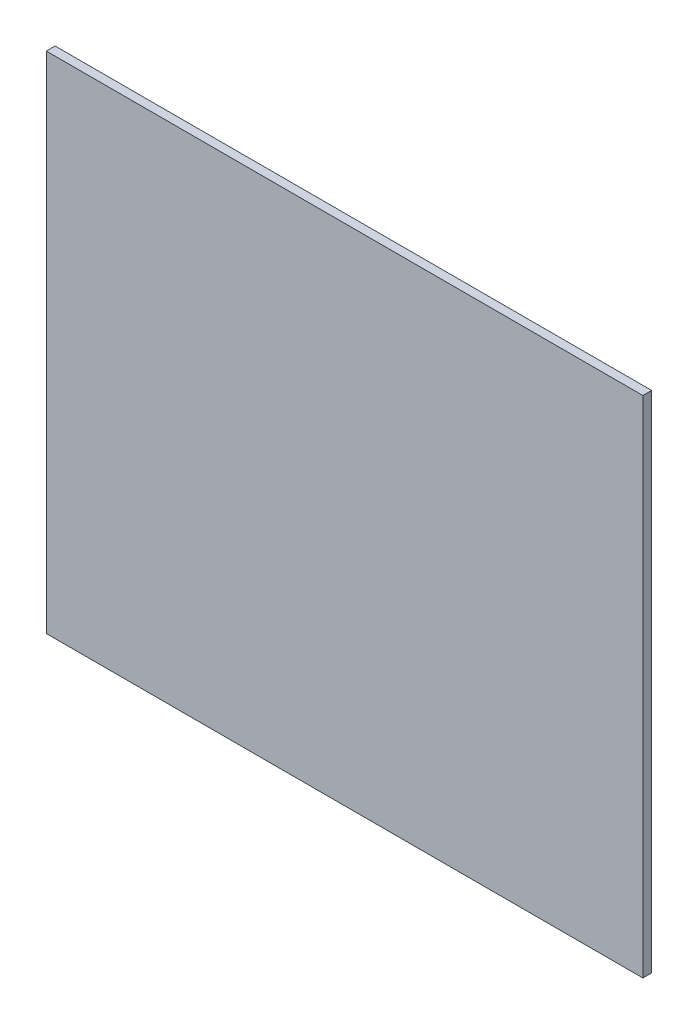
ISO-10303-21;
HEADER;
FILE_DESCRIPTION(('STEP AP214'),'2;1');
FILE_NAME('part.step','',(''),(''),'','','');
FILE_SCHEMA(('AUTOMOTIVE_DESIGN { 1 0 10303 214 1 1 1 1 }'));
ENDSEC;
DATA;
#1=APPLICATION_CONTEXT('core data for automotive mechanical design processes');
#2=APPLICATION_PROTOCOL_DEFINITION('international standard','automotive_design',2000,#1);
#3=PRODUCT_CONTEXT('',#1,'mechanical');
#4=PRODUCT('Part','Part','',(#3));
#5=PRODUCT_RELATED_PRODUCT_CATEGORY('part','',(#4));
#6=PRODUCT_DEFINITION_FORMATION('','',#4);
#7=PRODUCT_DEFINITION_CONTEXT('part definition',#1,'design');
#8=PRODUCT_DEFINITION('design','',#6,#7);
#9=PRODUCT_DEFINITION_SHAPE('','',#8);
#10=(LENGTH_UNIT() NAMED_UNIT(*) SI_UNIT(.MILLI.,.METRE.));
#11=(NAMED_UNIT(*) PLANE_ANGLE_UNIT() SI_UNIT($,.RADIAN.));
#12=(NAMED_UNIT(*) SI_UNIT($,.STERADIAN.) SOLID_ANGLE_UNIT());
#13=UNCERTAINTY_MEASURE_WITH_UNIT(LENGTH_MEASURE(1.E-05),#10,'distance_accuracy_value','');
#14=(GEOMETRIC_REPRESENTATION_CONTEXT(3) GLOBAL_UNCERTAINTY_ASSIGNED_CONTEXT((#13)) GLOBAL_UNIT_ASSIGNED_CONTEXT((#10,
#11,#12)) REPRESENTATION_CONTEXT('',''));
#15=CARTESIAN_POINT('',(0.,0.,0.));
#16=DIRECTION('',(0.,0.,1.));
#17=DIRECTION('',(1.,0.,0.));
#18=AXIS2_PLACEMENT_3D('',#15,#16,#17);
#19=CARTESIAN_POINT('',(340.,-287.5,10.));
#20=DIRECTION('',(-1.,0.,0.));
#21=DIRECTION('',(0.,0.,1.));
#22=AXIS2_PLACEMENT_3D('',#19,#20,#21);
#23=PLANE('',#22);
#24=DIRECTION('',(0.,1.,0.));
#25=VECTOR('',#24,1.);
#26=CARTESIAN_POINT('',(340.,-287.5,0.));
#27=LINE('',#26,#25);
#28=CARTESIAN_POINT('',(340.,-287.5,0.));
#29=VERTEX_POINT('',#28);
#30=CARTESIAN_POINT('',(340.,287.5,0.));
#31=VERTEX_POINT('',#30);
#32=EDGE_CURVE('E105',#29,#31,#27,.T.);
#33=ORIENTED_EDGE('',*,*,#32,.T.);
#34=DIRECTION('',(0.,0.,-1.));
#35=VECTOR('',#34,1.);
#36=CARTESIAN_POINT('',(340.,287.5,10.));
#37=LINE('',#36,#35);
#38=CARTESIAN_POINT('',(340.,287.5,10.));
#39=VERTEX_POINT('',#38);
#40=EDGE_CURVE('E11',#39,#31,#37,.T.);
#41=ORIENTED_EDGE('',*,*,#40,.F.);
#42=DIRECTION('',(0.,1.,0.));
#43=VECTOR('',#42,1.);
#44=CARTESIAN_POINT('',(340.,-287.5,10.));
#45=LINE('',#44,#43);
#46=CARTESIAN_POINT('',(340.,-287.5,10.));
#47=VERTEX_POINT('',#46);
#48=EDGE_CURVE('E89',#47,#39,#45,.T.);
#49=ORIENTED_EDGE('',*,*,#48,.F.);
#50=DIRECTION('',(0.,0.,-1.));
#51=VECTOR('',#50,1.);
#52=CARTESIAN_POINT('',(340.,-287.5,10.));
#53=LINE('',#52,#51);
#54=EDGE_CURVE('E97',#47,#29,#53,.T.);
#55=ORIENTED_EDGE('',*,*,#54,.T.);
#56=EDGE_LOOP('',(#33,#41,#49,#55));
#57=FACE_BOUND('',#56,.T.);
#58=ADVANCED_FACE('F39',(#57),#23,.F.);
#59=CARTESIAN_POINT('',(-340.,287.5,10.));
#60=DIRECTION('',(0.,-1.,0.));
#61=DIRECTION('',(0.,0.,-1.));
#62=AXIS2_PLACEMENT_3D('',#59,#60,#61);
#63=PLANE('',#62);
#64=DIRECTION('',(-1.,0.,0.));
#65=VECTOR('',#64,1.);
#66=CARTESIAN_POINT('',(-340.,287.5,0.));
#67=LINE('',#66,#65);
#68=CARTESIAN_POINT('',(-340.,287.5,0.));
#69=VERTEX_POINT('',#68);
#70=EDGE_CURVE('E92',#31,#69,#67,.T.);
#71=ORIENTED_EDGE('',*,*,#70,.T.);
#72=DIRECTION('',(0.,0.,-1.));
#73=VECTOR('',#72,1.);
#74=CARTESIAN_POINT('',(-340.,287.5,10.));
#75=LINE('',#74,#73);
#76=CARTESIAN_POINT('',(-340.,287.5,10.));
#77=VERTEX_POINT('',#76);
#78=EDGE_CURVE('E50',#77,#69,#75,.T.);
#79=ORIENTED_EDGE('',*,*,#78,.F.);
#80=DIRECTION('',(-1.,0.,0.));
#81=VECTOR('',#80,1.);
#82=CARTESIAN_POINT('',(-340.,287.5,10.));
#83=LINE('',#82,#81);
#84=EDGE_CURVE('E82',#39,#77,#83,.T.);
#85=ORIENTED_EDGE('',*,*,#84,.F.);
#86=ORIENTED_EDGE('',*,*,#40,.T.);
#87=EDGE_LOOP('',(#71,#79,#85,#86));
#88=FACE_BOUND('',#87,.T.);
#89=ADVANCED_FACE('F93',(#88),#63,.F.);
#90=CARTESIAN_POINT('',(-340.,-287.5,10.));
#91=DIRECTION('',(1.,0.,0.));
#92=DIRECTION('',(0.,0.,-1.));
#93=AXIS2_PLACEMENT_3D('',#90,#91,#92);
#94=PLANE('',#93);
#95=DIRECTION('',(0.,-1.,0.));
#96=VECTOR('',#95,1.);
#97=CARTESIAN_POINT('',(-340.,-287.5,0.));
#98=LINE('',#97,#96);
#99=CARTESIAN_POINT('',(-340.,-287.5,0.));
#100=VERTEX_POINT('',#99);
#101=EDGE_CURVE('E74',#69,#100,#98,.T.);
#102=ORIENTED_EDGE('',*,*,#101,.T.);
#103=DIRECTION('',(0.,0.,-1.));
#104=VECTOR('',#103,1.);
#105=CARTESIAN_POINT('',(-340.,-287.5,10.));
#106=LINE('',#105,#104);
#107=CARTESIAN_POINT('',(-340.,-287.5,10.));
#108=VERTEX_POINT('',#107);
#109=EDGE_CURVE('E94',#108,#100,#106,.T.);
#110=ORIENTED_EDGE('',*,*,#109,.F.);
#111=DIRECTION('',(0.,-1.,0.));
#112=VECTOR('',#111,1.);
#113=CARTESIAN_POINT('',(-340.,-287.5,10.));
#114=LINE('',#113,#112);
#115=EDGE_CURVE('E88',#77,#108,#114,.T.);
#116=ORIENTED_EDGE('',*,*,#115,.F.);
#117=ORIENTED_EDGE('',*,*,#78,.T.);
#118=EDGE_LOOP('',(#102,#110,#116,#117));
#119=FACE_BOUND('',#118,.T.);
#120=ADVANCED_FACE('F96',(#119),#94,.F.);
#121=CARTESIAN_POINT('',(-340.,-287.5,10.));
#122=DIRECTION('',(0.,1.,0.));
#123=DIRECTION('',(0.,0.,1.));
#124=AXIS2_PLACEMENT_3D('',#121,#122,#123);
#125=PLANE('',#124);
#126=DIRECTION('',(1.,0.,0.));
#127=VECTOR('',#126,1.);
#128=CARTESIAN_POINT('',(-340.,-287.5,0.));
#129=LINE('',#128,#127);
#130=EDGE_CURVE('E76',#100,#29,#129,.T.);
#131=ORIENTED_EDGE('',*,*,#130,.T.);
#132=ORIENTED_EDGE('',*,*,#54,.F.);
#133=DIRECTION('',(1.,0.,0.));
#134=VECTOR('',#133,1.);
#135=CARTESIAN_POINT('',(-340.,-287.5,10.));
#136=LINE('',#135,#134);
#137=EDGE_CURVE('E54',#108,#47,#136,.T.);
#138=ORIENTED_EDGE('',*,*,#137,.F.);
#139=ORIENTED_EDGE('',*,*,#109,.T.);
#140=EDGE_LOOP('',(#131,#132,#138,#139));
#141=FACE_BOUND('',#140,.T.);
#142=ADVANCED_FACE('F106',(#141),#125,.F.);
#143=CARTESIAN_POINT('',(0.,0.,10.));
#144=DIRECTION('',(0.,0.,-1.));
#145=DIRECTION('',(-1.,0.,0.));
#146=AXIS2_PLACEMENT_3D('',#143,#144,#145);
#147=PLANE('',#146);
#148=ORIENTED_EDGE('',*,*,#48,.T.);
#149=ORIENTED_EDGE('',*,*,#84,.T.);
#150=ORIENTED_EDGE('',*,*,#115,.T.);
#151=ORIENTED_EDGE('',*,*,#137,.T.);
#152=EDGE_LOOP('',(#148,#149,#150,#151));
#153=FACE_BOUND('',#152,.T.);
#154=ADVANCED_FACE('F86',(#153),#147,.F.);
#155=CARTESIAN_POINT('',(0.,0.,0.));
#156=DIRECTION('',(0.,0.,-1.));
#157=DIRECTION('',(-1.,0.,0.));
#158=AXIS2_PLACEMENT_3D('',#155,#156,#157);
#159=PLANE('',#158);
#160=ORIENTED_EDGE('',*,*,#32,.F.);
#161=ORIENTED_EDGE('',*,*,#130,.F.);
#162=ORIENTED_EDGE('',*,*,#101,.F.);
#163=ORIENTED_EDGE('',*,*,#70,.F.);
#164=EDGE_LOOP('',(#160,#161,#162,#163));
#165=FACE_BOUND('',#164,.T.);
#166=ADVANCED_FACE('F115',(#165),#159,.T.);
#167=CLOSED_SHELL('',(#58,#89,#120,#142,#154,#166));
#168=MANIFOLD_SOLID_BREP('B2',#167);
#169=ADVANCED_BREP_SHAPE_REPRESENTATION('',(#18,#168),#14);
#170=SHAPE_DEFINITION_REPRESENTATION(#9,#169);
ENDSEC;
END-ISO-10303-21;
